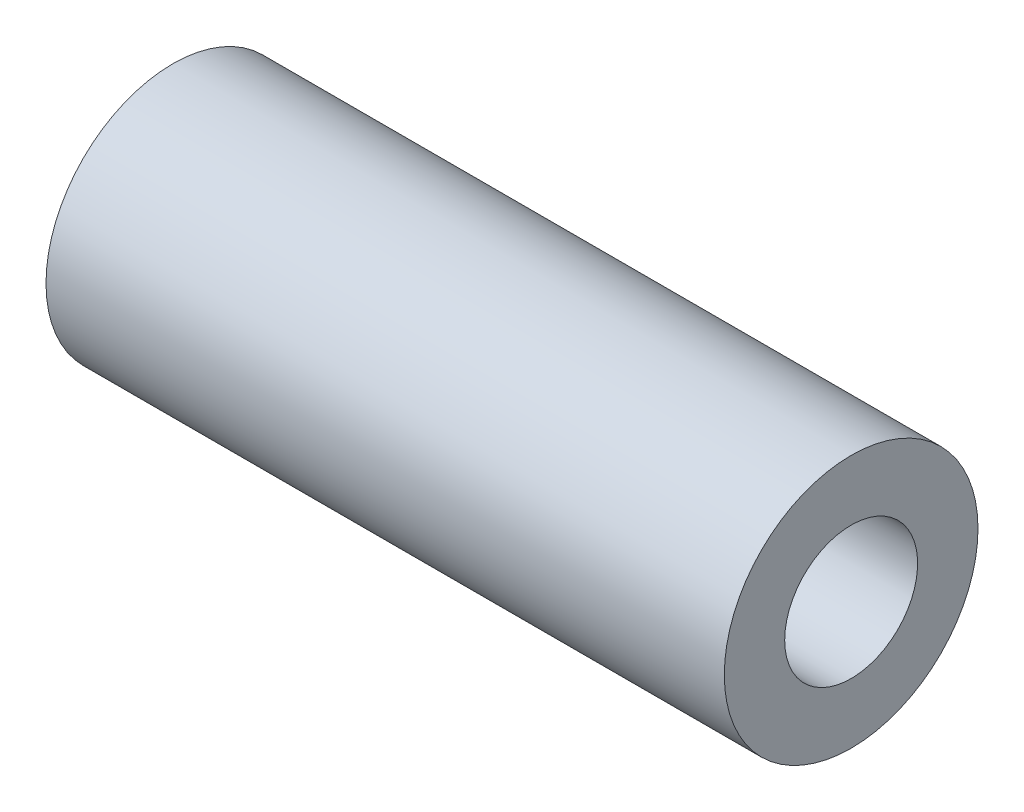
ISO-10303-21;
HEADER;
FILE_DESCRIPTION(('STEP AP214'),'2;1');
FILE_NAME('part.step','',(''),(''),'','','');
FILE_SCHEMA(('AUTOMOTIVE_DESIGN { 1 0 10303 214 1 1 1 1 }'));
ENDSEC;
DATA;
#1=APPLICATION_CONTEXT('core data for automotive mechanical design processes');
#2=APPLICATION_PROTOCOL_DEFINITION('international standard','automotive_design',2000,#1);
#3=PRODUCT_CONTEXT('',#1,'mechanical');
#4=PRODUCT('Part','Part','',(#3));
#5=PRODUCT_RELATED_PRODUCT_CATEGORY('part','',(#4));
#6=PRODUCT_DEFINITION_FORMATION('','',#4);
#7=PRODUCT_DEFINITION_CONTEXT('part definition',#1,'design');
#8=PRODUCT_DEFINITION('design','',#6,#7);
#9=PRODUCT_DEFINITION_SHAPE('','',#8);
#10=(LENGTH_UNIT() NAMED_UNIT(*) SI_UNIT(.MILLI.,.METRE.));
#11=(NAMED_UNIT(*) PLANE_ANGLE_UNIT() SI_UNIT($,.RADIAN.));
#12=(NAMED_UNIT(*) SI_UNIT($,.STERADIAN.) SOLID_ANGLE_UNIT());
#13=UNCERTAINTY_MEASURE_WITH_UNIT(LENGTH_MEASURE(1.E-05),#10,'distance_accuracy_value','');
#14=(GEOMETRIC_REPRESENTATION_CONTEXT(3) GLOBAL_UNCERTAINTY_ASSIGNED_CONTEXT((#13)) GLOBAL_UNIT_ASSIGNED_CONTEXT((#10,
#11,#12)) REPRESENTATION_CONTEXT('',''));
#15=CARTESIAN_POINT('',(0.,0.,0.));
#16=DIRECTION('',(0.,0.,1.));
#17=DIRECTION('',(1.,0.,0.));
#18=AXIS2_PLACEMENT_3D('',#15,#16,#17);
#19=CARTESIAN_POINT('',(12.7,0.,0.));
#20=DIRECTION('',(-1.,0.,0.));
#21=DIRECTION('',(0.,0.,1.));
#22=AXIS2_PLACEMENT_3D('',#19,#20,#21);
#23=CYLINDRICAL_SURFACE('',#22,2.4892);
#24=CARTESIAN_POINT('',(-12.7,0.,0.));
#25=DIRECTION('',(-1.,0.,0.));
#26=DIRECTION('',(0.,0.,1.));
#27=AXIS2_PLACEMENT_3D('',#24,#25,#26);
#28=CIRCLE('',#27,2.4892);
#29=CARTESIAN_POINT('',(-12.7,0.,2.4892));
#30=VERTEX_POINT('',#29);
#31=EDGE_CURVE('E26',#30,#30,#28,.T.);
#32=ORIENTED_EDGE('',*,*,#31,.T.);
#33=EDGE_LOOP('',(#32));
#34=FACE_BOUND('',#33,.T.);
#35=CARTESIAN_POINT('',(12.7,0.,0.));
#36=DIRECTION('',(-1.,0.,0.));
#37=DIRECTION('',(0.,0.,1.));
#38=AXIS2_PLACEMENT_3D('',#35,#36,#37);
#39=CIRCLE('',#38,2.4892);
#40=CARTESIAN_POINT('',(12.7,0.,2.4892));
#41=VERTEX_POINT('',#40);
#42=EDGE_CURVE('E17',#41,#41,#39,.T.);
#43=ORIENTED_EDGE('',*,*,#42,.F.);
#44=EDGE_LOOP('',(#43));
#45=FACE_BOUND('',#44,.T.);
#46=ADVANCED_FACE('F14',(#34,#45),#23,.F.);
#47=CARTESIAN_POINT('',(12.7,0.,0.));
#48=DIRECTION('',(1.,0.,0.));
#49=DIRECTION('',(0.,0.,-1.));
#50=AXIS2_PLACEMENT_3D('',#47,#48,#49);
#51=PLANE('',#50);
#52=ORIENTED_EDGE('',*,*,#42,.T.);
#53=EDGE_LOOP('',(#52));
#54=FACE_BOUND('',#53,.T.);
#55=CARTESIAN_POINT('',(12.7,0.,0.));
#56=DIRECTION('',(-1.,0.,0.));
#57=DIRECTION('',(0.,0.,1.));
#58=AXIS2_PLACEMENT_3D('',#55,#56,#57);
#59=CIRCLE('',#58,4.7498);
#60=CARTESIAN_POINT('',(12.7,0.,4.7498));
#61=VERTEX_POINT('',#60);
#62=EDGE_CURVE('E21',#61,#61,#59,.T.);
#63=ORIENTED_EDGE('',*,*,#62,.F.);
#64=EDGE_LOOP('',(#63));
#65=FACE_BOUND('',#64,.T.);
#66=ADVANCED_FACE('F34',(#54,#65),#51,.T.);
#67=CARTESIAN_POINT('',(-12.7,0.,0.));
#68=DIRECTION('',(1.,0.,0.));
#69=DIRECTION('',(0.,0.,-1.));
#70=AXIS2_PLACEMENT_3D('',#67,#68,#69);
#71=PLANE('',#70);
#72=ORIENTED_EDGE('',*,*,#31,.F.);
#73=EDGE_LOOP('',(#72));
#74=FACE_BOUND('',#73,.T.);
#75=CARTESIAN_POINT('',(-12.7,0.,0.));
#76=DIRECTION('',(-1.,0.,0.));
#77=DIRECTION('',(0.,0.,1.));
#78=AXIS2_PLACEMENT_3D('',#75,#76,#77);
#79=CIRCLE('',#78,4.7498);
#80=CARTESIAN_POINT('',(-12.7,0.,4.7498));
#81=VERTEX_POINT('',#80);
#82=EDGE_CURVE('E10',#81,#81,#79,.F.);
#83=ORIENTED_EDGE('',*,*,#82,.F.);
#84=EDGE_LOOP('',(#83));
#85=FACE_BOUND('',#84,.T.);
#86=ADVANCED_FACE('F42',(#74,#85),#71,.F.);
#87=CARTESIAN_POINT('',(12.7,0.,0.));
#88=DIRECTION('',(-1.,0.,0.));
#89=DIRECTION('',(0.,0.,1.));
#90=AXIS2_PLACEMENT_3D('',#87,#88,#89);
#91=CYLINDRICAL_SURFACE('',#90,4.7498);
#92=ORIENTED_EDGE('',*,*,#82,.T.);
#93=EDGE_LOOP('',(#92));
#94=FACE_BOUND('',#93,.T.);
#95=ORIENTED_EDGE('',*,*,#62,.T.);
#96=EDGE_LOOP('',(#95));
#97=FACE_BOUND('',#96,.T.);
#98=ADVANCED_FACE('F43',(#94,#97),#91,.T.);
#99=CLOSED_SHELL('',(#46,#66,#86,#98));
#100=MANIFOLD_SOLID_BREP('B1',#99);
#101=ADVANCED_BREP_SHAPE_REPRESENTATION('',(#18,#100),#14);
#102=SHAPE_DEFINITION_REPRESENTATION(#9,#101);
ENDSEC;
END-ISO-10303-21;
